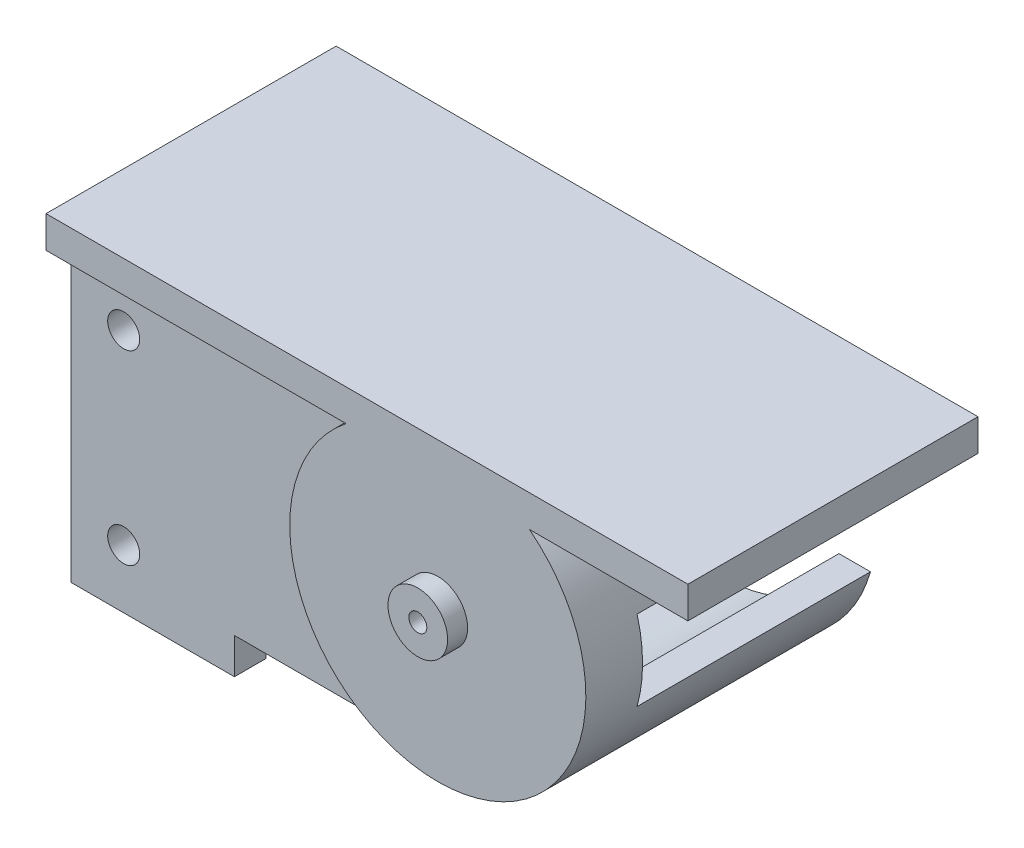
ISO-10303-21;
HEADER;
FILE_DESCRIPTION(('STEP AP214'),'2;1');
FILE_NAME('part.step','',(''),(''),'','','');
FILE_SCHEMA(('AUTOMOTIVE_DESIGN { 1 0 10303 214 1 1 1 1 }'));
ENDSEC;
DATA;
#1=APPLICATION_CONTEXT('core data for automotive mechanical design processes');
#2=APPLICATION_PROTOCOL_DEFINITION('international standard','automotive_design',2000,#1);
#3=PRODUCT_CONTEXT('',#1,'mechanical');
#4=PRODUCT('Part','Part','',(#3));
#5=PRODUCT_RELATED_PRODUCT_CATEGORY('part','',(#4));
#6=PRODUCT_DEFINITION_FORMATION('','',#4);
#7=PRODUCT_DEFINITION_CONTEXT('part definition',#1,'design');
#8=PRODUCT_DEFINITION('design','',#6,#7);
#9=PRODUCT_DEFINITION_SHAPE('','',#8);
#10=(LENGTH_UNIT() NAMED_UNIT(*) SI_UNIT(.MILLI.,.METRE.));
#11=(NAMED_UNIT(*) PLANE_ANGLE_UNIT() SI_UNIT($,.RADIAN.));
#12=(NAMED_UNIT(*) SI_UNIT($,.STERADIAN.) SOLID_ANGLE_UNIT());
#13=UNCERTAINTY_MEASURE_WITH_UNIT(LENGTH_MEASURE(1.E-05),#10,'distance_accuracy_value','');
#14=(GEOMETRIC_REPRESENTATION_CONTEXT(3) GLOBAL_UNCERTAINTY_ASSIGNED_CONTEXT((#13)) GLOBAL_UNIT_ASSIGNED_CONTEXT((#10,
#11,#12)) REPRESENTATION_CONTEXT('',''));
#15=CARTESIAN_POINT('',(0.,0.,0.));
#16=DIRECTION('',(0.,0.,1.));
#17=DIRECTION('',(1.,0.,0.));
#18=AXIS2_PLACEMENT_3D('',#15,#16,#17);
#19=CARTESIAN_POINT('',(0.,0.,31.));
#20=DIRECTION('',(0.,0.,1.));
#21=DIRECTION('',(1.,0.,0.));
#22=AXIS2_PLACEMENT_3D('',#19,#20,#21);
#23=PLANE('',#22);
#24=CARTESIAN_POINT('',(0.,0.,31.));
#25=DIRECTION('',(0.,0.,1.));
#26=DIRECTION('',(1.,0.,0.));
#27=AXIS2_PLACEMENT_3D('',#24,#25,#26);
#28=CIRCLE('',#27,2.98);
#29=CARTESIAN_POINT('',(2.98,0.,31.));
#30=VERTEX_POINT('',#29);
#31=EDGE_CURVE('E12',#30,#30,#28,.T.);
#32=ORIENTED_EDGE('',*,*,#31,.T.);
#33=EDGE_LOOP('',(#32));
#34=FACE_BOUND('',#33,.T.);
#35=CARTESIAN_POINT('',(0.,0.,31.));
#36=DIRECTION('',(0.,0.,1.));
#37=DIRECTION('',(1.,0.,0.));
#38=AXIS2_PLACEMENT_3D('',#35,#36,#37);
#39=CIRCLE('',#38,0.9);
#40=CARTESIAN_POINT('',(0.9,0.,31.));
#41=VERTEX_POINT('',#40);
#42=EDGE_CURVE('E84',#41,#41,#39,.T.);
#43=ORIENTED_EDGE('',*,*,#42,.F.);
#44=EDGE_LOOP('',(#43));
#45=FACE_BOUND('',#44,.T.);
#46=ADVANCED_FACE('F73',(#34,#45),#23,.T.);
#47=CARTESIAN_POINT('',(0.,0.,29.));
#48=DIRECTION('',(0.,0.,1.));
#49=DIRECTION('',(1.,0.,0.));
#50=AXIS2_PLACEMENT_3D('',#47,#48,#49);
#51=PLANE('',#50);
#52=CARTESIAN_POINT('',(0.,0.,29.));
#53=DIRECTION('',(0.,0.,1.));
#54=DIRECTION('',(1.,0.,0.));
#55=AXIS2_PLACEMENT_3D('',#52,#53,#54);
#56=CIRCLE('',#55,2.98);
#57=CARTESIAN_POINT('',(2.98,0.,29.));
#58=VERTEX_POINT('',#57);
#59=EDGE_CURVE('E77',#58,#58,#56,.T.);
#60=ORIENTED_EDGE('',*,*,#59,.F.);
#61=EDGE_LOOP('',(#60));
#62=FACE_BOUND('',#61,.T.);
#63=CARTESIAN_POINT('',(0.,0.,29.));
#64=DIRECTION('',(0.,0.,1.));
#65=DIRECTION('',(1.,0.,0.));
#66=AXIS2_PLACEMENT_3D('',#63,#64,#65);
#67=CIRCLE('',#66,0.9);
#68=CARTESIAN_POINT('',(0.9,0.,29.));
#69=VERTEX_POINT('',#68);
#70=EDGE_CURVE('E86',#69,#69,#67,.T.);
#71=ORIENTED_EDGE('',*,*,#70,.T.);
#72=EDGE_LOOP('',(#71));
#73=FACE_BOUND('',#72,.T.);
#74=ADVANCED_FACE('F96',(#62,#73),#51,.F.);
#75=CARTESIAN_POINT('',(0.,0.,31.));
#76=DIRECTION('',(0.,0.,-1.));
#77=DIRECTION('',(-1.,0.,0.));
#78=AXIS2_PLACEMENT_3D('',#75,#76,#77);
#79=CYLINDRICAL_SURFACE('',#78,2.98);
#80=ORIENTED_EDGE('',*,*,#31,.F.);
#81=EDGE_LOOP('',(#80));
#82=FACE_BOUND('',#81,.T.);
#83=ORIENTED_EDGE('',*,*,#59,.T.);
#84=EDGE_LOOP('',(#83));
#85=FACE_BOUND('',#84,.T.);
#86=ADVANCED_FACE('F75',(#82,#85),#79,.T.);
#87=CARTESIAN_POINT('',(0.,0.,31.));
#88=DIRECTION('',(0.,0.,-1.));
#89=DIRECTION('',(-1.,0.,0.));
#90=AXIS2_PLACEMENT_3D('',#87,#88,#89);
#91=CYLINDRICAL_SURFACE('',#90,0.9);
#92=ORIENTED_EDGE('',*,*,#42,.T.);
#93=EDGE_LOOP('',(#92));
#94=FACE_BOUND('',#93,.T.);
#95=ORIENTED_EDGE('',*,*,#70,.F.);
#96=EDGE_LOOP('',(#95));
#97=FACE_BOUND('',#96,.T.);
#98=ADVANCED_FACE('F92',(#94,#97),#91,.F.);
#99=CLOSED_SHELL('',(#46,#74,#86,#98));
#100=MANIFOLD_SOLID_BREP('B2',#99);
#101=CARTESIAN_POINT('',(0.,0.,23.33));
#102=DIRECTION('',(0.,0.,-1.));
#103=DIRECTION('',(-1.,0.,0.));
#104=AXIS2_PLACEMENT_3D('',#101,#102,#103);
#105=CYLINDRICAL_SURFACE('',#104,14.8);
#106=DIRECTION('',(0.,0.,-1.));
#107=VECTOR('',#106,1.);
#108=CARTESIAN_POINT('',(-14.2492105044455,4.,32.1436259527263));
#109=LINE('',#108,#107);
#110=CARTESIAN_POINT('',(-14.2492105044455,4.,23.32));
#111=VERTEX_POINT('',#110);
#112=CARTESIAN_POINT('',(-14.2492105044455,4.,0.));
#113=VERTEX_POINT('',#112);
#114=EDGE_CURVE('E489',#111,#113,#109,.T.);
#115=ORIENTED_EDGE('',*,*,#114,.F.);
#116=CARTESIAN_POINT('',(0.,0.,23.32));
#117=DIRECTION('',(0.,0.,1.));
#118=DIRECTION('',(1.,0.,0.));
#119=AXIS2_PLACEMENT_3D('',#116,#117,#118);
#120=CIRCLE('',#119,14.8);
#121=CARTESIAN_POINT('',(-9.16600240017425,11.62,23.32));
#122=VERTEX_POINT('',#121);
#123=EDGE_CURVE('E455',#111,#122,#120,.F.);
#124=ORIENTED_EDGE('',*,*,#123,.T.);
#125=DIRECTION('',(0.,0.,-1.));
#126=VECTOR('',#125,1.);
#127=CARTESIAN_POINT('',(-9.16600240017425,11.62,68.2948869957715));
#128=LINE('',#127,#126);
#129=CARTESIAN_POINT('',(-9.16600240017425,11.62,0.));
#130=VERTEX_POINT('',#129);
#131=EDGE_CURVE('E347',#122,#130,#128,.T.);
#132=ORIENTED_EDGE('',*,*,#131,.T.);
#133=CARTESIAN_POINT('',(0.,0.,0.));
#134=DIRECTION('',(0.,0.,1.));
#135=DIRECTION('',(1.,0.,0.));
#136=AXIS2_PLACEMENT_3D('',#133,#134,#135);
#137=CIRCLE('',#136,14.8);
#138=EDGE_CURVE('E71',#130,#113,#137,.T.);
#139=ORIENTED_EDGE('',*,*,#138,.T.);
#140=EDGE_LOOP('',(#115,#124,#132,#139));
#141=FACE_BOUND('',#140,.T.);
#142=ADVANCED_FACE('F135',(#141),#105,.T.);
#143=CARTESIAN_POINT('',(0.,0.,0.));
#144=DIRECTION('',(0.,0.,1.));
#145=DIRECTION('',(1.,0.,0.));
#146=AXIS2_PLACEMENT_3D('',#143,#144,#145);
#147=PLANE('',#146);
#148=DIRECTION('',(-1.,0.,0.));
#149=VECTOR('',#148,1.);
#150=CARTESIAN_POINT('',(0.,4.,0.));
#151=LINE('',#150,#149);
#152=CARTESIAN_POINT('',(14.2492105044455,4.,0.));
#153=VERTEX_POINT('',#152);
#154=CARTESIAN_POINT('',(11.1013512691023,4.,0.));
#155=VERTEX_POINT('',#154);
#156=EDGE_CURVE('E280',#153,#155,#151,.T.);
#157=ORIENTED_EDGE('',*,*,#156,.T.);
#158=CARTESIAN_POINT('',(0.,0.,0.));
#159=DIRECTION('',(0.,0.,1.));
#160=DIRECTION('',(1.,0.,0.));
#161=AXIS2_PLACEMENT_3D('',#158,#159,#160);
#162=CIRCLE('',#161,11.8);
#163=CARTESIAN_POINT('',(-11.1013512691023,4.,0.));
#164=VERTEX_POINT('',#163);
#165=EDGE_CURVE('E308',#155,#164,#162,.T.);
#166=ORIENTED_EDGE('',*,*,#165,.T.);
#167=DIRECTION('',(-1.,0.,0.));
#168=VECTOR('',#167,1.);
#169=CARTESIAN_POINT('',(0.,4.,0.));
#170=LINE('',#169,#168);
#171=EDGE_CURVE('E479',#164,#113,#170,.T.);
#172=ORIENTED_EDGE('',*,*,#171,.T.);
#173=ORIENTED_EDGE('',*,*,#138,.F.);
#174=DIRECTION('',(1.,0.,0.));
#175=VECTOR('',#174,1.);
#176=CARTESIAN_POINT('',(0.,11.62,0.));
#177=LINE('',#176,#175);
#178=CARTESIAN_POINT('',(-39.1660024001742,11.62,0.));
#179=VERTEX_POINT('',#178);
#180=EDGE_CURVE('E351',#179,#130,#177,.T.);
#181=ORIENTED_EDGE('',*,*,#180,.F.);
#182=DIRECTION('',(0.,-1.,0.));
#183=VECTOR('',#182,1.);
#184=CARTESIAN_POINT('',(-39.1660024001742,0.,0.));
#185=LINE('',#184,#183);
#186=CARTESIAN_POINT('',(-39.1660024001742,14.8,0.));
#187=VERTEX_POINT('',#186);
#188=EDGE_CURVE('E356',#187,#179,#185,.T.);
#189=ORIENTED_EDGE('',*,*,#188,.F.);
#190=DIRECTION('',(1.,0.,0.));
#191=VECTOR('',#190,1.);
#192=CARTESIAN_POINT('',(0.,14.8,0.));
#193=LINE('',#192,#191);
#194=CARTESIAN_POINT('',(25.,14.8,0.));
#195=VERTEX_POINT('',#194);
#196=EDGE_CURVE('E365',#187,#195,#193,.T.);
#197=ORIENTED_EDGE('',*,*,#196,.T.);
#198=DIRECTION('',(0.,1.,0.));
#199=VECTOR('',#198,1.);
#200=CARTESIAN_POINT('',(25.,0.,0.));
#201=LINE('',#200,#199);
#202=CARTESIAN_POINT('',(25.,11.62,0.));
#203=VERTEX_POINT('',#202);
#204=EDGE_CURVE('E374',#203,#195,#201,.T.);
#205=ORIENTED_EDGE('',*,*,#204,.F.);
#206=DIRECTION('',(1.,0.,0.));
#207=VECTOR('',#206,1.);
#208=CARTESIAN_POINT('',(0.,11.62,0.));
#209=LINE('',#208,#207);
#210=CARTESIAN_POINT('',(9.16600240017425,11.62,0.));
#211=VERTEX_POINT('',#210);
#212=EDGE_CURVE('E306',#211,#203,#209,.T.);
#213=ORIENTED_EDGE('',*,*,#212,.F.);
#214=EDGE_CURVE('E145',#153,#211,#137,.T.);
#215=ORIENTED_EDGE('',*,*,#214,.F.);
#216=EDGE_LOOP('',(#157,#166,#172,#173,#181,#189,#197,#205,#213,#215));
#217=FACE_BOUND('',#216,.T.);
#218=ADVANCED_FACE('F303',(#217),#147,.F.);
#219=CARTESIAN_POINT('',(0.,0.,23.33));
#220=DIRECTION('',(0.,0.,-1.));
#221=DIRECTION('',(-1.,0.,0.));
#222=AXIS2_PLACEMENT_3D('',#219,#220,#221);
#223=CYLINDRICAL_SURFACE('',#222,11.8);
#224=ORIENTED_EDGE('',*,*,#165,.F.);
#225=DIRECTION('',(0.,0.,-1.));
#226=VECTOR('',#225,1.);
#227=CARTESIAN_POINT('',(11.1013512691023,4.,32.1436259527263));
#228=LINE('',#227,#226);
#229=CARTESIAN_POINT('',(11.1013512691023,4.,23.33));
#230=VERTEX_POINT('',#229);
#231=EDGE_CURVE('E286',#230,#155,#228,.T.);
#232=ORIENTED_EDGE('',*,*,#231,.F.);
#233=CARTESIAN_POINT('',(0.,0.,23.33));
#234=DIRECTION('',(0.,0.,1.));
#235=DIRECTION('',(1.,0.,0.));
#236=AXIS2_PLACEMENT_3D('',#233,#234,#235);
#237=CIRCLE('',#236,11.8);
#238=CARTESIAN_POINT('',(-11.1013512691023,4.,23.33));
#239=VERTEX_POINT('',#238);
#240=EDGE_CURVE('E315',#230,#239,#237,.T.);
#241=ORIENTED_EDGE('',*,*,#240,.T.);
#242=DIRECTION('',(0.,0.,-1.));
#243=VECTOR('',#242,1.);
#244=CARTESIAN_POINT('',(-11.1013512691023,4.,32.1436259527263));
#245=LINE('',#244,#243);
#246=EDGE_CURVE('E488',#239,#164,#245,.T.);
#247=ORIENTED_EDGE('',*,*,#246,.T.);
#248=EDGE_LOOP('',(#224,#232,#241,#247));
#249=FACE_BOUND('',#248,.T.);
#250=ADVANCED_FACE('F603',(#249),#223,.F.);
#251=CARTESIAN_POINT('',(0.,11.62,68.2948869957715));
#252=DIRECTION('',(0.,1.,0.));
#253=DIRECTION('',(-1.,0.,0.));
#254=AXIS2_PLACEMENT_3D('',#251,#252,#253);
#255=PLANE('',#254);
#256=ORIENTED_EDGE('',*,*,#131,.F.);
#257=DIRECTION('',(1.,0.,0.));
#258=VECTOR('',#257,1.);
#259=CARTESIAN_POINT('',(-39.1660024001742,11.62,23.32));
#260=LINE('',#259,#258);
#261=CARTESIAN_POINT('',(-39.1660024001742,11.62,23.32));
#262=VERTEX_POINT('',#261);
#263=EDGE_CURVE('E419',#262,#122,#260,.T.);
#264=ORIENTED_EDGE('',*,*,#263,.F.);
#265=DIRECTION('',(0.,0.,-1.));
#266=VECTOR('',#265,1.);
#267=CARTESIAN_POINT('',(-39.1660024001742,11.62,68.2948869957715));
#268=LINE('',#267,#266);
#269=EDGE_CURVE('E352',#262,#179,#268,.T.);
#270=ORIENTED_EDGE('',*,*,#269,.T.);
#271=ORIENTED_EDGE('',*,*,#180,.T.);
#272=EDGE_LOOP('',(#256,#264,#270,#271));
#273=FACE_BOUND('',#272,.T.);
#274=ADVANCED_FACE('F554',(#273),#255,.F.);
#275=CARTESIAN_POINT('',(-22.8306830953215,-18.38,26.5));
#276=DIRECTION('',(-1.,0.,0.));
#277=DIRECTION('',(0.,0.,1.));
#278=AXIS2_PLACEMENT_3D('',#275,#276,#277);
#279=PLANE('',#278);
#280=DIRECTION('',(0.,0.,1.));
#281=VECTOR('',#280,1.);
#282=CARTESIAN_POINT('',(-22.8306830953215,-14.8,-11.5978534649397));
#283=LINE('',#282,#281);
#284=CARTESIAN_POINT('',(-22.8306830953215,-14.8,23.32));
#285=VERTEX_POINT('',#284);
#286=CARTESIAN_POINT('',(-22.8306830953215,-14.8,26.5));
#287=VERTEX_POINT('',#286);
#288=EDGE_CURVE('E435',#285,#287,#283,.T.);
#289=ORIENTED_EDGE('',*,*,#288,.T.);
#290=DIRECTION('',(0.,1.,0.));
#291=VECTOR('',#290,1.);
#292=CARTESIAN_POINT('',(-22.8306830953215,-18.38,26.5));
#293=LINE('',#292,#291);
#294=CARTESIAN_POINT('',(-22.8306830953215,-18.38,26.5));
#295=VERTEX_POINT('',#294);
#296=EDGE_CURVE('E405',#295,#287,#293,.T.);
#297=ORIENTED_EDGE('',*,*,#296,.F.);
#298=DIRECTION('',(0.,0.,1.));
#299=VECTOR('',#298,1.);
#300=CARTESIAN_POINT('',(-22.8306830953215,-18.38,26.5));
#301=LINE('',#300,#299);
#302=CARTESIAN_POINT('',(-22.8306830953215,-18.38,23.32));
#303=VERTEX_POINT('',#302);
#304=EDGE_CURVE('E426',#303,#295,#301,.T.);
#305=ORIENTED_EDGE('',*,*,#304,.F.);
#306=DIRECTION('',(0.,1.,0.));
#307=VECTOR('',#306,1.);
#308=CARTESIAN_POINT('',(-22.8306830953215,-18.38,23.32));
#309=LINE('',#308,#307);
#310=EDGE_CURVE('E401',#303,#285,#309,.T.);
#311=ORIENTED_EDGE('',*,*,#310,.T.);
#312=EDGE_LOOP('',(#289,#297,#305,#311));
#313=FACE_BOUND('',#312,.T.);
#314=ADVANCED_FACE('F589',(#313),#279,.F.);
#315=DIRECTION('',(-1.,0.,0.));
#316=VECTOR('',#315,1.);
#317=CARTESIAN_POINT('',(-39.1660024001742,11.62,26.5));
#318=LINE('',#317,#316);
#319=CARTESIAN_POINT('',(-9.16600240017425,11.62,26.5));
#320=VERTEX_POINT('',#319);
#321=CARTESIAN_POINT('',(-39.1660024001742,11.62,26.5));
#322=VERTEX_POINT('',#321);
#323=EDGE_CURVE('E414',#320,#322,#318,.T.);
#324=ORIENTED_EDGE('',*,*,#323,.F.);
#325=CARTESIAN_POINT('',(-9.16600240017425,11.62,29.));
#326=VERTEX_POINT('',#325);
#327=EDGE_CURVE('E342',#326,#320,#128,.T.);
#328=ORIENTED_EDGE('',*,*,#327,.F.);
#329=DIRECTION('',(1.,0.,0.));
#330=VECTOR('',#329,1.);
#331=CARTESIAN_POINT('',(0.,11.62,29.));
#332=LINE('',#331,#330);
#333=CARTESIAN_POINT('',(-39.1660024001742,11.62,29.));
#334=VERTEX_POINT('',#333);
#335=EDGE_CURVE('E338',#334,#326,#332,.T.);
#336=ORIENTED_EDGE('',*,*,#335,.F.);
#337=EDGE_CURVE('E348',#334,#322,#268,.T.);
#338=ORIENTED_EDGE('',*,*,#337,.T.);
#339=EDGE_LOOP('',(#324,#328,#336,#338));
#340=FACE_BOUND('',#339,.T.);
#341=ADVANCED_FACE('F577',(#340),#255,.F.);
#342=CARTESIAN_POINT('',(-14.2492105044455,-4.,0.));
#343=VERTEX_POINT('',#342);
#344=CARTESIAN_POINT('',(14.2492105044455,-4.,0.));
#345=VERTEX_POINT('',#344);
#346=EDGE_CURVE('E144',#343,#345,#137,.T.);
#347=ORIENTED_EDGE('',*,*,#346,.T.);
#348=DIRECTION('',(0.,0.,-1.));
#349=VECTOR('',#348,1.);
#350=CARTESIAN_POINT('',(14.2492105044455,-4.,32.1436259527263));
#351=LINE('',#350,#349);
#352=CARTESIAN_POINT('',(14.2492105044455,-4.,23.33));
#353=VERTEX_POINT('',#352);
#354=EDGE_CURVE('E471',#353,#345,#351,.T.);
#355=ORIENTED_EDGE('',*,*,#354,.F.);
#356=CARTESIAN_POINT('',(0.,0.,23.33));
#357=DIRECTION('',(0.,0.,1.));
#358=DIRECTION('',(1.,0.,0.));
#359=AXIS2_PLACEMENT_3D('',#356,#357,#358);
#360=CIRCLE('',#359,14.8);
#361=CARTESIAN_POINT('',(14.2492105044455,4.,23.33));
#362=VERTEX_POINT('',#361);
#363=EDGE_CURVE('E292',#362,#353,#360,.F.);
#364=ORIENTED_EDGE('',*,*,#363,.F.);
#365=DIRECTION('',(0.,0.,-1.));
#366=VECTOR('',#365,1.);
#367=CARTESIAN_POINT('',(14.2492105044455,4.,32.1436259527263));
#368=LINE('',#367,#366);
#369=EDGE_CURVE('E283',#362,#153,#368,.T.);
#370=ORIENTED_EDGE('',*,*,#369,.T.);
#371=ORIENTED_EDGE('',*,*,#214,.T.);
#372=DIRECTION('',(0.,0.,-1.));
#373=VECTOR('',#372,1.);
#374=CARTESIAN_POINT('',(9.16600240017425,11.62,68.2948869957715));
#375=LINE('',#374,#373);
#376=CARTESIAN_POINT('',(9.16600240017425,11.62,29.));
#377=VERTEX_POINT('',#376);
#378=EDGE_CURVE('E378',#377,#211,#375,.T.);
#379=ORIENTED_EDGE('',*,*,#378,.F.);
#380=CARTESIAN_POINT('',(0.,0.,29.));
#381=DIRECTION('',(0.,0.,1.));
#382=DIRECTION('',(1.,0.,0.));
#383=AXIS2_PLACEMENT_3D('',#380,#381,#382);
#384=CIRCLE('',#383,14.8);
#385=EDGE_CURVE('E329',#326,#377,#384,.T.);
#386=ORIENTED_EDGE('',*,*,#385,.F.);
#387=ORIENTED_EDGE('',*,*,#327,.T.);
#388=CARTESIAN_POINT('',(0.,0.,26.5));
#389=DIRECTION('',(0.,0.,1.));
#390=DIRECTION('',(1.,0.,0.));
#391=AXIS2_PLACEMENT_3D('',#388,#389,#390);
#392=CIRCLE('',#391,14.8);
#393=CARTESIAN_POINT('',(0.,-14.8,26.5));
#394=VERTEX_POINT('',#393);
#395=EDGE_CURVE('E446',#320,#394,#392,.T.);
#396=ORIENTED_EDGE('',*,*,#395,.T.);
#397=DIRECTION('',(0.,0.,1.));
#398=VECTOR('',#397,1.);
#399=CARTESIAN_POINT('',(0.,-14.8,-11.5978534649397));
#400=LINE('',#399,#398);
#401=CARTESIAN_POINT('',(0.,-14.8,23.32));
#402=VERTEX_POINT('',#401);
#403=EDGE_CURVE('E439',#402,#394,#400,.T.);
#404=ORIENTED_EDGE('',*,*,#403,.F.);
#405=CARTESIAN_POINT('',(-14.2492105044455,-4.,23.32));
#406=VERTEX_POINT('',#405);
#407=EDGE_CURVE('E423',#402,#406,#120,.F.);
#408=ORIENTED_EDGE('',*,*,#407,.T.);
#409=DIRECTION('',(0.,0.,-1.));
#410=VECTOR('',#409,1.);
#411=CARTESIAN_POINT('',(-14.2492105044455,-4.,32.1436259527263));
#412=LINE('',#411,#410);
#413=EDGE_CURVE('E483',#406,#343,#412,.T.);
#414=ORIENTED_EDGE('',*,*,#413,.T.);
#415=EDGE_LOOP('',(#347,#355,#364,#370,#371,#379,#386,#387,#396,#404,#408,#414));
#416=FACE_BOUND('',#415,.T.);
#417=ADVANCED_FACE('F137',(#416),#105,.T.);
#418=CARTESIAN_POINT('',(-11.1013512691023,-4.,0.));
#419=VERTEX_POINT('',#418);
#420=CARTESIAN_POINT('',(11.1013512691023,-4.,0.));
#421=VERTEX_POINT('',#420);
#422=EDGE_CURVE('E311',#419,#421,#162,.T.);
#423=ORIENTED_EDGE('',*,*,#422,.T.);
#424=DIRECTION('',(-1.,0.,0.));
#425=VECTOR('',#424,1.);
#426=CARTESIAN_POINT('',(0.,-4.,0.));
#427=LINE('',#426,#425);
#428=EDGE_CURVE('E518',#345,#421,#427,.T.);
#429=ORIENTED_EDGE('',*,*,#428,.F.);
#430=ORIENTED_EDGE('',*,*,#346,.F.);
#431=DIRECTION('',(-1.,0.,0.));
#432=VECTOR('',#431,1.);
#433=CARTESIAN_POINT('',(0.,-4.,0.));
#434=LINE('',#433,#432);
#435=EDGE_CURVE('E499',#419,#343,#434,.T.);
#436=ORIENTED_EDGE('',*,*,#435,.F.);
#437=EDGE_LOOP('',(#423,#429,#430,#436));
#438=FACE_BOUND('',#437,.T.);
#439=ADVANCED_FACE('F535',(#438),#147,.F.);
#440=DIRECTION('',(0.,0.,-1.));
#441=VECTOR('',#440,1.);
#442=CARTESIAN_POINT('',(11.1013512691023,-4.,32.1436259527263));
#443=LINE('',#442,#441);
#444=CARTESIAN_POINT('',(11.1013512691023,-4.,23.33));
#445=VERTEX_POINT('',#444);
#446=EDGE_CURVE('E510',#445,#421,#443,.T.);
#447=ORIENTED_EDGE('',*,*,#446,.T.);
#448=ORIENTED_EDGE('',*,*,#422,.F.);
#449=DIRECTION('',(0.,0.,-1.));
#450=VECTOR('',#449,1.);
#451=CARTESIAN_POINT('',(-11.1013512691023,-4.,32.1436259527263));
#452=LINE('',#451,#450);
#453=CARTESIAN_POINT('',(-11.1013512691023,-4.,23.33));
#454=VERTEX_POINT('',#453);
#455=EDGE_CURVE('E475',#454,#419,#452,.T.);
#456=ORIENTED_EDGE('',*,*,#455,.F.);
#457=EDGE_CURVE('E320',#454,#445,#237,.T.);
#458=ORIENTED_EDGE('',*,*,#457,.T.);
#459=EDGE_LOOP('',(#447,#448,#456,#458));
#460=FACE_BOUND('',#459,.T.);
#461=ADVANCED_FACE('F532',(#460),#223,.F.);
#462=CARTESIAN_POINT('',(0.,0.,23.33));
#463=DIRECTION('',(0.,0.,1.));
#464=DIRECTION('',(1.,0.,0.));
#465=AXIS2_PLACEMENT_3D('',#462,#463,#464);
#466=PLANE('',#465);
#467=CARTESIAN_POINT('',(0.,0.,23.33));
#468=DIRECTION('',(0.,0.,1.));
#469=DIRECTION('',(1.,0.,0.));
#470=AXIS2_PLACEMENT_3D('',#467,#468,#469);
#471=CIRCLE('',#470,9.25);
#472=CARTESIAN_POINT('',(9.25,0.,23.33));
#473=VERTEX_POINT('',#472);
#474=EDGE_CURVE('E321',#473,#473,#471,.T.);
#475=ORIENTED_EDGE('',*,*,#474,.T.);
#476=EDGE_LOOP('',(#475));
#477=FACE_BOUND('',#476,.T.);
#478=ORIENTED_EDGE('',*,*,#240,.F.);
#479=DIRECTION('',(-1.,0.,0.));
#480=VECTOR('',#479,1.);
#481=CARTESIAN_POINT('',(0.,4.,23.33));
#482=LINE('',#481,#480);
#483=EDGE_CURVE('E478',#362,#230,#482,.T.);
#484=ORIENTED_EDGE('',*,*,#483,.F.);
#485=ORIENTED_EDGE('',*,*,#363,.T.);
#486=DIRECTION('',(-1.,0.,0.));
#487=VECTOR('',#486,1.);
#488=CARTESIAN_POINT('',(0.,-4.,23.33));
#489=LINE('',#488,#487);
#490=EDGE_CURVE('E152',#353,#445,#489,.T.);
#491=ORIENTED_EDGE('',*,*,#490,.T.);
#492=ORIENTED_EDGE('',*,*,#457,.F.);
#493=DIRECTION('',(-1.,0.,0.));
#494=VECTOR('',#493,1.);
#495=CARTESIAN_POINT('',(0.,-4.,23.33));
#496=LINE('',#495,#494);
#497=CARTESIAN_POINT('',(-14.2492105044455,-4.,23.33));
#498=VERTEX_POINT('',#497);
#499=EDGE_CURVE('E500',#454,#498,#496,.T.);
#500=ORIENTED_EDGE('',*,*,#499,.T.);
#501=CARTESIAN_POINT('',(0.,0.,23.33));
#502=DIRECTION('',(0.,0.,1.));
#503=DIRECTION('',(1.,0.,0.));
#504=AXIS2_PLACEMENT_3D('',#501,#502,#503);
#505=CIRCLE('',#504,14.8);
#506=CARTESIAN_POINT('',(-14.2492105044455,4.,23.33));
#507=VERTEX_POINT('',#506);
#508=EDGE_CURVE('E482',#498,#507,#505,.F.);
#509=ORIENTED_EDGE('',*,*,#508,.T.);
#510=DIRECTION('',(-1.,0.,0.));
#511=VECTOR('',#510,1.);
#512=CARTESIAN_POINT('',(0.,4.,23.33));
#513=LINE('',#512,#511);
#514=EDGE_CURVE('E496',#239,#507,#513,.T.);
#515=ORIENTED_EDGE('',*,*,#514,.F.);
#516=EDGE_LOOP('',(#478,#484,#485,#491,#492,#500,#509,#515));
#517=FACE_BOUND('',#516,.T.);
#518=ADVANCED_FACE('F601',(#477,#517),#466,.F.);
#519=CARTESIAN_POINT('',(0.,0.,26.67));
#520=DIRECTION('',(0.,0.,-1.));
#521=DIRECTION('',(-1.,0.,0.));
#522=AXIS2_PLACEMENT_3D('',#519,#520,#521);
#523=CYLINDRICAL_SURFACE('',#522,9.25);
#524=CARTESIAN_POINT('',(0.,0.,26.67));
#525=DIRECTION('',(0.,0.,1.));
#526=DIRECTION('',(1.,0.,0.));
#527=AXIS2_PLACEMENT_3D('',#524,#525,#526);
#528=CIRCLE('',#527,9.25);
#529=CARTESIAN_POINT('',(9.25,0.,26.67));
#530=VERTEX_POINT('',#529);
#531=EDGE_CURVE('E325',#530,#530,#528,.T.);
#532=ORIENTED_EDGE('',*,*,#531,.T.);
#533=EDGE_LOOP('',(#532));
#534=FACE_BOUND('',#533,.T.);
#535=ORIENTED_EDGE('',*,*,#474,.F.);
#536=EDGE_LOOP('',(#535));
#537=FACE_BOUND('',#536,.T.);
#538=ADVANCED_FACE('F642',(#534,#537),#523,.F.);
#539=CARTESIAN_POINT('',(0.,0.,26.67));
#540=DIRECTION('',(0.,0.,1.));
#541=DIRECTION('',(1.,0.,0.));
#542=AXIS2_PLACEMENT_3D('',#539,#540,#541);
#543=PLANE('',#542);
#544=CARTESIAN_POINT('',(0.,0.,26.67));
#545=DIRECTION('',(0.,0.,1.));
#546=DIRECTION('',(1.,0.,0.));
#547=AXIS2_PLACEMENT_3D('',#544,#545,#546);
#548=CIRCLE('',#547,2.98);
#549=CARTESIAN_POINT('',(2.98,0.,26.67));
#550=VERTEX_POINT('',#549);
#551=EDGE_CURVE('E334',#550,#550,#548,.T.);
#552=ORIENTED_EDGE('',*,*,#551,.T.);
#553=EDGE_LOOP('',(#552));
#554=FACE_BOUND('',#553,.T.);
#555=ORIENTED_EDGE('',*,*,#531,.F.);
#556=EDGE_LOOP('',(#555));
#557=FACE_BOUND('',#556,.T.);
#558=ADVANCED_FACE('F639',(#554,#557),#543,.F.);
#559=CARTESIAN_POINT('',(0.,0.,29.));
#560=DIRECTION('',(0.,0.,1.));
#561=DIRECTION('',(1.,0.,0.));
#562=AXIS2_PLACEMENT_3D('',#559,#560,#561);
#563=PLANE('',#562);
#564=ORIENTED_EDGE('',*,*,#385,.T.);
#565=DIRECTION('',(1.,0.,0.));
#566=VECTOR('',#565,1.);
#567=CARTESIAN_POINT('',(0.,11.62,29.));
#568=LINE('',#567,#566);
#569=CARTESIAN_POINT('',(25.,11.62,29.));
#570=VERTEX_POINT('',#569);
#571=EDGE_CURVE('E382',#377,#570,#568,.T.);
#572=ORIENTED_EDGE('',*,*,#571,.T.);
#573=DIRECTION('',(0.,1.,0.));
#574=VECTOR('',#573,1.);
#575=CARTESIAN_POINT('',(25.,0.,29.));
#576=LINE('',#575,#574);
#577=CARTESIAN_POINT('',(25.,14.8,29.));
#578=VERTEX_POINT('',#577);
#579=EDGE_CURVE('E385',#570,#578,#576,.T.);
#580=ORIENTED_EDGE('',*,*,#579,.T.);
#581=DIRECTION('',(1.,0.,0.));
#582=VECTOR('',#581,1.);
#583=CARTESIAN_POINT('',(0.,14.8,29.));
#584=LINE('',#583,#582);
#585=CARTESIAN_POINT('',(-39.1660024001742,14.8,29.));
#586=VERTEX_POINT('',#585);
#587=EDGE_CURVE('E346',#586,#578,#584,.T.);
#588=ORIENTED_EDGE('',*,*,#587,.F.);
#589=DIRECTION('',(0.,-1.,0.));
#590=VECTOR('',#589,1.);
#591=CARTESIAN_POINT('',(-39.1660024001742,0.,29.));
#592=LINE('',#591,#590);
#593=EDGE_CURVE('E359',#586,#334,#592,.T.);
#594=ORIENTED_EDGE('',*,*,#593,.T.);
#595=ORIENTED_EDGE('',*,*,#335,.T.);
#596=EDGE_LOOP('',(#564,#572,#580,#588,#594,#595));
#597=FACE_BOUND('',#596,.T.);
#598=CARTESIAN_POINT('',(0.,0.,29.));
#599=DIRECTION('',(0.,0.,1.));
#600=DIRECTION('',(1.,0.,0.));
#601=AXIS2_PLACEMENT_3D('',#598,#599,#600);
#602=CIRCLE('',#601,2.98);
#603=CARTESIAN_POINT('',(2.98,0.,29.));
#604=VERTEX_POINT('',#603);
#605=EDGE_CURVE('E333',#604,#604,#602,.T.);
#606=ORIENTED_EDGE('',*,*,#605,.F.);
#607=EDGE_LOOP('',(#606));
#608=FACE_BOUND('',#607,.T.);
#609=ADVANCED_FACE('F572',(#597,#608),#563,.T.);
#610=CARTESIAN_POINT('',(0.,0.,29.));
#611=DIRECTION('',(0.,0.,-1.));
#612=DIRECTION('',(-1.,0.,0.));
#613=AXIS2_PLACEMENT_3D('',#610,#611,#612);
#614=CYLINDRICAL_SURFACE('',#613,2.98);
#615=ORIENTED_EDGE('',*,*,#605,.T.);
#616=EDGE_LOOP('',(#615));
#617=FACE_BOUND('',#616,.T.);
#618=ORIENTED_EDGE('',*,*,#551,.F.);
#619=EDGE_LOOP('',(#618));
#620=FACE_BOUND('',#619,.T.);
#621=ADVANCED_FACE('F633',(#617,#620),#614,.F.);
#622=CARTESIAN_POINT('',(0.,14.8,68.2948869957715));
#623=DIRECTION('',(0.,1.,0.));
#624=DIRECTION('',(-1.,0.,0.));
#625=AXIS2_PLACEMENT_3D('',#622,#623,#624);
#626=PLANE('',#625);
#627=DIRECTION('',(0.,0.,-1.));
#628=VECTOR('',#627,1.);
#629=CARTESIAN_POINT('',(-39.1660024001742,14.8,68.2948869957715));
#630=LINE('',#629,#628);
#631=EDGE_CURVE('E353',#586,#187,#630,.T.);
#632=ORIENTED_EDGE('',*,*,#631,.F.);
#633=ORIENTED_EDGE('',*,*,#587,.T.);
#634=DIRECTION('',(0.,0.,-1.));
#635=VECTOR('',#634,1.);
#636=CARTESIAN_POINT('',(25.,14.8,68.2948869957715));
#637=LINE('',#636,#635);
#638=EDGE_CURVE('E390',#578,#195,#637,.T.);
#639=ORIENTED_EDGE('',*,*,#638,.T.);
#640=ORIENTED_EDGE('',*,*,#196,.F.);
#641=EDGE_LOOP('',(#632,#633,#639,#640));
#642=FACE_BOUND('',#641,.T.);
#643=ADVANCED_FACE('F561',(#642),#626,.T.);
#644=CARTESIAN_POINT('',(-39.1660024001742,0.,68.2948869957715));
#645=DIRECTION('',(1.,0.,0.));
#646=DIRECTION('',(0.,0.,-1.));
#647=AXIS2_PLACEMENT_3D('',#644,#645,#646);
#648=PLANE('',#647);
#649=ORIENTED_EDGE('',*,*,#593,.F.);
#650=ORIENTED_EDGE('',*,*,#631,.T.);
#651=ORIENTED_EDGE('',*,*,#188,.T.);
#652=ORIENTED_EDGE('',*,*,#269,.F.);
#653=DIRECTION('',(0.,1.,0.));
#654=VECTOR('',#653,1.);
#655=CARTESIAN_POINT('',(-39.1660024001742,-18.38,23.32));
#656=LINE('',#655,#654);
#657=CARTESIAN_POINT('',(-39.1660024001742,-18.38,23.32));
#658=VERTEX_POINT('',#657);
#659=EDGE_CURVE('E386',#658,#262,#656,.T.);
#660=ORIENTED_EDGE('',*,*,#659,.F.);
#661=DIRECTION('',(0.,0.,-1.));
#662=VECTOR('',#661,1.);
#663=CARTESIAN_POINT('',(-39.1660024001742,-18.38,26.5));
#664=LINE('',#663,#662);
#665=CARTESIAN_POINT('',(-39.1660024001742,-18.38,26.5));
#666=VERTEX_POINT('',#665);
#667=EDGE_CURVE('E418',#666,#658,#664,.T.);
#668=ORIENTED_EDGE('',*,*,#667,.F.);
#669=DIRECTION('',(0.,1.,0.));
#670=VECTOR('',#669,1.);
#671=CARTESIAN_POINT('',(-39.1660024001742,-18.38,26.5));
#672=LINE('',#671,#670);
#673=EDGE_CURVE('E409',#666,#322,#672,.T.);
#674=ORIENTED_EDGE('',*,*,#673,.T.);
#675=ORIENTED_EDGE('',*,*,#337,.F.);
#676=EDGE_LOOP('',(#649,#650,#651,#652,#660,#668,#674,#675));
#677=FACE_BOUND('',#676,.T.);
#678=ADVANCED_FACE('F628',(#677),#648,.F.);
#679=CARTESIAN_POINT('',(25.,0.,68.2948869957715));
#680=DIRECTION('',(-1.,0.,0.));
#681=DIRECTION('',(0.,0.,1.));
#682=AXIS2_PLACEMENT_3D('',#679,#680,#681);
#683=PLANE('',#682);
#684=ORIENTED_EDGE('',*,*,#579,.F.);
#685=DIRECTION('',(0.,0.,-1.));
#686=VECTOR('',#685,1.);
#687=CARTESIAN_POINT('',(25.,11.62,68.2948869957715));
#688=LINE('',#687,#686);
#689=EDGE_CURVE('E379',#570,#203,#688,.T.);
#690=ORIENTED_EDGE('',*,*,#689,.T.);
#691=ORIENTED_EDGE('',*,*,#204,.T.);
#692=ORIENTED_EDGE('',*,*,#638,.F.);
#693=EDGE_LOOP('',(#684,#690,#691,#692));
#694=FACE_BOUND('',#693,.T.);
#695=ADVANCED_FACE('F566',(#694),#683,.F.);
#696=CARTESIAN_POINT('',(0.,11.62,68.2948869957715));
#697=DIRECTION('',(0.,1.,0.));
#698=DIRECTION('',(-1.,0.,0.));
#699=AXIS2_PLACEMENT_3D('',#696,#697,#698);
#700=PLANE('',#699);
#701=ORIENTED_EDGE('',*,*,#571,.F.);
#702=ORIENTED_EDGE('',*,*,#378,.T.);
#703=ORIENTED_EDGE('',*,*,#212,.T.);
#704=ORIENTED_EDGE('',*,*,#689,.F.);
#705=EDGE_LOOP('',(#701,#702,#703,#704));
#706=FACE_BOUND('',#705,.T.);
#707=ADVANCED_FACE('F569',(#706),#700,.F.);
#708=CARTESIAN_POINT('',(-39.1660024001742,-18.38,23.32));
#709=DIRECTION('',(0.,0.,1.));
#710=DIRECTION('',(1.,0.,0.));
#711=AXIS2_PLACEMENT_3D('',#708,#709,#710);
#712=PLANE('',#711);
#713=CARTESIAN_POINT('',(-33.8999999953216,6.08566633715911,23.32));
#714=DIRECTION('',(0.,0.,1.));
#715=DIRECTION('',(1.,0.,0.));
#716=AXIS2_PLACEMENT_3D('',#713,#714,#715);
#717=CIRCLE('',#716,1.60000000000001);
#718=CARTESIAN_POINT('',(-32.2999999953215,6.08566633715911,23.32));
#719=VERTEX_POINT('',#718);
#720=EDGE_CURVE('E450',#719,#719,#717,.T.);
#721=ORIENTED_EDGE('',*,*,#720,.T.);
#722=EDGE_LOOP('',(#721));
#723=FACE_BOUND('',#722,.T.);
#724=CARTESIAN_POINT('',(-33.8999999953216,-12.5143336628409,23.32));
#725=DIRECTION('',(0.,0.,1.));
#726=DIRECTION('',(1.,0.,0.));
#727=AXIS2_PLACEMENT_3D('',#724,#725,#726);
#728=CIRCLE('',#727,1.6);
#729=CARTESIAN_POINT('',(-32.2999999953215,-12.5143336628409,23.32));
#730=VERTEX_POINT('',#729);
#731=EDGE_CURVE('E462',#730,#730,#728,.T.);
#732=ORIENTED_EDGE('',*,*,#731,.T.);
#733=EDGE_LOOP('',(#732));
#734=FACE_BOUND('',#733,.T.);
#735=ORIENTED_EDGE('',*,*,#263,.T.);
#736=ORIENTED_EDGE('',*,*,#123,.F.);
#737=EDGE_CURVE('E454',#406,#111,#120,.F.);
#738=ORIENTED_EDGE('',*,*,#737,.F.);
#739=ORIENTED_EDGE('',*,*,#407,.F.);
#740=DIRECTION('',(1.,0.,0.));
#741=VECTOR('',#740,1.);
#742=CARTESIAN_POINT('',(0.,-14.8,23.32));
#743=LINE('',#742,#741);
#744=EDGE_CURVE('E443',#285,#402,#743,.T.);
#745=ORIENTED_EDGE('',*,*,#744,.F.);
#746=ORIENTED_EDGE('',*,*,#310,.F.);
#747=DIRECTION('',(1.,0.,0.));
#748=VECTOR('',#747,1.);
#749=CARTESIAN_POINT('',(-39.1660024001742,-18.38,23.32));
#750=LINE('',#749,#748);
#751=EDGE_CURVE('E429',#658,#303,#750,.T.);
#752=ORIENTED_EDGE('',*,*,#751,.F.);
#753=ORIENTED_EDGE('',*,*,#659,.T.);
#754=EDGE_LOOP('',(#735,#736,#738,#739,#745,#746,#752,#753));
#755=FACE_BOUND('',#754,.T.);
#756=ADVANCED_FACE('F593',(#723,#734,#755),#712,.F.);
#757=CARTESIAN_POINT('',(-39.1660024001742,-18.38,26.5));
#758=DIRECTION('',(0.,0.,-1.));
#759=DIRECTION('',(-1.,0.,0.));
#760=AXIS2_PLACEMENT_3D('',#757,#758,#759);
#761=PLANE('',#760);
#762=CARTESIAN_POINT('',(-33.8999999953216,6.08566633715911,26.5));
#763=DIRECTION('',(0.,0.,1.));
#764=DIRECTION('',(1.,0.,0.));
#765=AXIS2_PLACEMENT_3D('',#762,#763,#764);
#766=CIRCLE('',#765,1.60000000000001);
#767=CARTESIAN_POINT('',(-32.2999999953215,6.08566633715911,26.5));
#768=VERTEX_POINT('',#767);
#769=EDGE_CURVE('E466',#768,#768,#766,.T.);
#770=ORIENTED_EDGE('',*,*,#769,.F.);
#771=EDGE_LOOP('',(#770));
#772=FACE_BOUND('',#771,.T.);
#773=CARTESIAN_POINT('',(-33.8999999953216,-12.5143336628409,26.5));
#774=DIRECTION('',(0.,0.,1.));
#775=DIRECTION('',(1.,0.,0.));
#776=AXIS2_PLACEMENT_3D('',#773,#774,#775);
#777=CIRCLE('',#776,1.6);
#778=CARTESIAN_POINT('',(-32.2999999953215,-12.5143336628409,26.5));
#779=VERTEX_POINT('',#778);
#780=EDGE_CURVE('E467',#779,#779,#777,.T.);
#781=ORIENTED_EDGE('',*,*,#780,.F.);
#782=EDGE_LOOP('',(#781));
#783=FACE_BOUND('',#782,.T.);
#784=ORIENTED_EDGE('',*,*,#323,.T.);
#785=ORIENTED_EDGE('',*,*,#673,.F.);
#786=DIRECTION('',(-1.,0.,0.));
#787=VECTOR('',#786,1.);
#788=CARTESIAN_POINT('',(-39.1660024001742,-18.38,26.5));
#789=LINE('',#788,#787);
#790=EDGE_CURVE('E413',#295,#666,#789,.T.);
#791=ORIENTED_EDGE('',*,*,#790,.F.);
#792=ORIENTED_EDGE('',*,*,#296,.T.);
#793=DIRECTION('',(-1.,0.,0.));
#794=VECTOR('',#793,1.);
#795=CARTESIAN_POINT('',(0.,-14.8,26.5));
#796=LINE('',#795,#794);
#797=EDGE_CURVE('E440',#394,#287,#796,.T.);
#798=ORIENTED_EDGE('',*,*,#797,.F.);
#799=ORIENTED_EDGE('',*,*,#395,.F.);
#800=EDGE_LOOP('',(#784,#785,#791,#792,#798,#799));
#801=FACE_BOUND('',#800,.T.);
#802=ADVANCED_FACE('F581',(#772,#783,#801),#761,.F.);
#803=CARTESIAN_POINT('',(0.,-18.38,0.));
#804=DIRECTION('',(0.,-1.,0.));
#805=DIRECTION('',(1.,0.,0.));
#806=AXIS2_PLACEMENT_3D('',#803,#804,#805);
#807=PLANE('',#806);
#808=ORIENTED_EDGE('',*,*,#667,.T.);
#809=ORIENTED_EDGE('',*,*,#751,.T.);
#810=ORIENTED_EDGE('',*,*,#304,.T.);
#811=ORIENTED_EDGE('',*,*,#790,.T.);
#812=EDGE_LOOP('',(#808,#809,#810,#811));
#813=FACE_BOUND('',#812,.T.);
#814=ADVANCED_FACE('F703',(#813),#807,.T.);
#815=CARTESIAN_POINT('',(0.,-14.8,-11.5978534649397));
#816=DIRECTION('',(0.,1.,0.));
#817=DIRECTION('',(0.,0.,1.));
#818=AXIS2_PLACEMENT_3D('',#815,#816,#817);
#819=PLANE('',#818);
#820=ORIENTED_EDGE('',*,*,#288,.F.);
#821=ORIENTED_EDGE('',*,*,#744,.T.);
#822=ORIENTED_EDGE('',*,*,#403,.T.);
#823=ORIENTED_EDGE('',*,*,#797,.T.);
#824=EDGE_LOOP('',(#820,#821,#822,#823));
#825=FACE_BOUND('',#824,.T.);
#826=ADVANCED_FACE('F587',(#825),#819,.F.);
#827=CARTESIAN_POINT('',(-33.8999999953216,-12.5143336628409,0.));
#828=DIRECTION('',(0.,0.,1.));
#829=DIRECTION('',(1.,0.,0.));
#830=AXIS2_PLACEMENT_3D('',#827,#828,#829);
#831=CYLINDRICAL_SURFACE('',#830,1.6);
#832=CARTESIAN_POINT('',(-32.2999999953215,-12.5143336628409,26.5));
#833=CARTESIAN_POINT('',(-32.2999999953215,-12.5143336628409,26.466875));
#834=CARTESIAN_POINT('',(-32.2999999953215,-12.5143336628409,26.43375));
#835=CARTESIAN_POINT('',(-32.2999999953215,-12.5143336628409,26.3675));
#836=CARTESIAN_POINT('',(-32.2999999953215,-12.5143336628409,26.334375));
#837=CARTESIAN_POINT('',(-32.2999999953215,-12.5143336628409,26.268125));
#838=CARTESIAN_POINT('',(-32.2999999953215,-12.5143336628409,26.235));
#839=CARTESIAN_POINT('',(-32.2999999953215,-12.5143336628409,26.16875));
#840=CARTESIAN_POINT('',(-32.2999999953215,-12.5143336628409,26.135625));
#841=CARTESIAN_POINT('',(-32.2999999953215,-12.5143336628409,26.069375));
#842=CARTESIAN_POINT('',(-32.2999999953215,-12.5143336628409,26.03625));
#843=CARTESIAN_POINT('',(-32.2999999953215,-12.5143336628409,25.97));
#844=CARTESIAN_POINT('',(-32.2999999953215,-12.5143336628409,25.936875));
#845=CARTESIAN_POINT('',(-32.2999999953215,-12.5143336628409,25.870625));
#846=CARTESIAN_POINT('',(-32.2999999953215,-12.5143336628409,25.8375));
#847=CARTESIAN_POINT('',(-32.2999999953215,-12.5143336628409,25.77125));
#848=CARTESIAN_POINT('',(-32.2999999953215,-12.5143336628409,25.738125));
#849=CARTESIAN_POINT('',(-32.2999999953215,-12.5143336628409,25.671875));
#850=CARTESIAN_POINT('',(-32.2999999953215,-12.5143336628409,25.63875));
#851=CARTESIAN_POINT('',(-32.2999999953215,-12.5143336628409,25.5725));
#852=CARTESIAN_POINT('',(-32.2999999953215,-12.5143336628409,25.539375));
#853=CARTESIAN_POINT('',(-32.2999999953215,-12.5143336628409,25.473125));
#854=CARTESIAN_POINT('',(-32.2999999953215,-12.5143336628409,25.44));
#855=CARTESIAN_POINT('',(-32.2999999953215,-12.5143336628409,25.37375));
#856=CARTESIAN_POINT('',(-32.2999999953215,-12.5143336628409,25.340625));
#857=CARTESIAN_POINT('',(-32.2999999953215,-12.5143336628409,25.274375));
#858=CARTESIAN_POINT('',(-32.2999999953215,-12.5143336628409,25.24125));
#859=CARTESIAN_POINT('',(-32.2999999953215,-12.5143336628409,25.175));
#860=CARTESIAN_POINT('',(-32.2999999953215,-12.5143336628409,25.141875));
#861=CARTESIAN_POINT('',(-32.2999999953215,-12.5143336628409,25.075625));
#862=CARTESIAN_POINT('',(-32.2999999953215,-12.5143336628409,25.0425));
#863=CARTESIAN_POINT('',(-32.2999999953215,-12.5143336628409,24.97625));
#864=CARTESIAN_POINT('',(-32.2999999953215,-12.5143336628409,24.943125));
#865=CARTESIAN_POINT('',(-32.2999999953215,-12.5143336628409,24.876875));
#866=CARTESIAN_POINT('',(-32.2999999953215,-12.5143336628409,24.84375));
#867=CARTESIAN_POINT('',(-32.2999999953215,-12.5143336628409,24.7775));
#868=CARTESIAN_POINT('',(-32.2999999953215,-12.5143336628409,24.744375));
#869=CARTESIAN_POINT('',(-32.2999999953215,-12.5143336628409,24.678125));
#870=CARTESIAN_POINT('',(-32.2999999953215,-12.5143336628409,24.645));
#871=CARTESIAN_POINT('',(-32.2999999953215,-12.5143336628409,24.57875));
#872=CARTESIAN_POINT('',(-32.2999999953215,-12.5143336628409,24.545625));
#873=CARTESIAN_POINT('',(-32.2999999953215,-12.5143336628409,24.479375));
#874=CARTESIAN_POINT('',(-32.2999999953215,-12.5143336628409,24.44625));
#875=CARTESIAN_POINT('',(-32.2999999953215,-12.5143336628409,24.38));
#876=CARTESIAN_POINT('',(-32.2999999953215,-12.5143336628409,24.346875));
#877=CARTESIAN_POINT('',(-32.2999999953215,-12.5143336628409,24.280625));
#878=CARTESIAN_POINT('',(-32.2999999953215,-12.5143336628409,24.2475));
#879=CARTESIAN_POINT('',(-32.2999999953215,-12.5143336628409,24.18125));
#880=CARTESIAN_POINT('',(-32.2999999953215,-12.5143336628409,24.148125));
#881=CARTESIAN_POINT('',(-32.2999999953215,-12.5143336628409,24.081875));
#882=CARTESIAN_POINT('',(-32.2999999953215,-12.5143336628409,24.04875));
#883=CARTESIAN_POINT('',(-32.2999999953215,-12.5143336628409,23.9825));
#884=CARTESIAN_POINT('',(-32.2999999953215,-12.5143336628409,23.949375));
#885=CARTESIAN_POINT('',(-32.2999999953215,-12.5143336628409,23.883125));
#886=CARTESIAN_POINT('',(-32.2999999953215,-12.5143336628409,23.85));
#887=CARTESIAN_POINT('',(-32.2999999953215,-12.5143336628409,23.78375));
#888=CARTESIAN_POINT('',(-32.2999999953215,-12.5143336628409,23.750625));
#889=CARTESIAN_POINT('',(-32.2999999953215,-12.5143336628409,23.684375));
#890=CARTESIAN_POINT('',(-32.2999999953215,-12.5143336628409,23.65125));
#891=CARTESIAN_POINT('',(-32.2999999953215,-12.5143336628409,23.585));
#892=CARTESIAN_POINT('',(-32.2999999953215,-12.5143336628409,23.551875));
#893=CARTESIAN_POINT('',(-32.2999999953215,-12.5143336628409,23.485625));
#894=CARTESIAN_POINT('',(-32.2999999953215,-12.5143336628409,23.4525));
#895=CARTESIAN_POINT('',(-32.2999999953215,-12.5143336628409,23.38625));
#896=CARTESIAN_POINT('',(-32.2999999953215,-12.5143336628409,23.353125));
#897=CARTESIAN_POINT('',(-32.2999999953215,-12.5143336628409,23.32));
#898=B_SPLINE_CURVE_WITH_KNOTS('',3,(#832,#833,#834,#835,#836,#837,#838,#839,#840,#841,#842,
#843,#844,#845,#846,#847,#848,#849,#850,#851,#852,#853,#854,#855,#856,#857,#858,#859,#860,#861,
#862,#863,#864,#865,#866,#867,#868,#869,#870,#871,#872,#873,#874,#875,#876,#877,#878,#879,#880,
#881,#882,#883,#884,#885,#886,#887,#888,#889,#890,#891,#892,#893,#894,#895,#896,#897),
.UNSPECIFIED.,.F.,.F.,(4,2,2,2,2,2,2,2,2,2,2,2,2,2,2,2,2,2,2,2,2,2,2,2,2,2,2,2,2,2,2,2,4),(0.,
0.0993749999999988,0.198750000000001,0.298125,0.397500000000002,0.496875000000001,
0.596250000000003,0.695625000000002,0.795000000000004,0.894375000000003,0.993750000000002,
1.093125,1.1925,1.291875,1.39125,1.49062500000001,1.59,1.689375,1.78875000000001,1.888125,
1.98750000000001,2.08687500000001,2.18625000000001,2.28562500000001,2.38500000000001,
2.48437500000001,2.58375000000001,2.68312500000001,2.78250000000001,2.88187500000001,
2.98125000000001,3.08062500000001,3.18000000000001),.UNSPECIFIED.);
#899=EDGE_CURVE('BSEAM719',#779,#730,#898,.T.);
#900=ORIENTED_EDGE('',*,*,#780,.T.);
#901=ORIENTED_EDGE('',*,*,#731,.F.);
#902=ORIENTED_EDGE('',*,*,#899,.T.);
#903=ORIENTED_EDGE('',*,*,#899,.F.);
#904=EDGE_LOOP('',(#900,#902,#901,#903));
#905=FACE_BOUND('',#904,.T.);
#906=ADVANCED_FACE('F719',(#905),#831,.F.);
#907=CARTESIAN_POINT('',(-33.8999999953216,6.08566633715911,0.));
#908=DIRECTION('',(0.,0.,1.));
#909=DIRECTION('',(1.,0.,0.));
#910=AXIS2_PLACEMENT_3D('',#907,#908,#909);
#911=CYLINDRICAL_SURFACE('',#910,1.60000000000001);
#912=CARTESIAN_POINT('',(-32.2999999953215,6.08566633715911,26.5));
#913=CARTESIAN_POINT('',(-32.2999999953215,6.08566633715911,26.466875));
#914=CARTESIAN_POINT('',(-32.2999999953215,6.08566633715911,26.43375));
#915=CARTESIAN_POINT('',(-32.2999999953215,6.08566633715911,26.3675));
#916=CARTESIAN_POINT('',(-32.2999999953215,6.08566633715911,26.334375));
#917=CARTESIAN_POINT('',(-32.2999999953215,6.08566633715911,26.268125));
#918=CARTESIAN_POINT('',(-32.2999999953215,6.08566633715911,26.235));
#919=CARTESIAN_POINT('',(-32.2999999953215,6.08566633715911,26.16875));
#920=CARTESIAN_POINT('',(-32.2999999953215,6.08566633715911,26.135625));
#921=CARTESIAN_POINT('',(-32.2999999953215,6.08566633715911,26.069375));
#922=CARTESIAN_POINT('',(-32.2999999953215,6.08566633715911,26.03625));
#923=CARTESIAN_POINT('',(-32.2999999953215,6.08566633715911,25.97));
#924=CARTESIAN_POINT('',(-32.2999999953215,6.08566633715911,25.936875));
#925=CARTESIAN_POINT('',(-32.2999999953215,6.08566633715911,25.870625));
#926=CARTESIAN_POINT('',(-32.2999999953215,6.08566633715911,25.8375));
#927=CARTESIAN_POINT('',(-32.2999999953215,6.08566633715911,25.77125));
#928=CARTESIAN_POINT('',(-32.2999999953215,6.08566633715911,25.738125));
#929=CARTESIAN_POINT('',(-32.2999999953215,6.08566633715911,25.671875));
#930=CARTESIAN_POINT('',(-32.2999999953215,6.08566633715911,25.63875));
#931=CARTESIAN_POINT('',(-32.2999999953215,6.08566633715911,25.5725));
#932=CARTESIAN_POINT('',(-32.2999999953215,6.08566633715911,25.539375));
#933=CARTESIAN_POINT('',(-32.2999999953215,6.08566633715911,25.473125));
#934=CARTESIAN_POINT('',(-32.2999999953215,6.08566633715911,25.44));
#935=CARTESIAN_POINT('',(-32.2999999953215,6.08566633715911,25.37375));
#936=CARTESIAN_POINT('',(-32.2999999953215,6.08566633715911,25.340625));
#937=CARTESIAN_POINT('',(-32.2999999953215,6.08566633715911,25.274375));
#938=CARTESIAN_POINT('',(-32.2999999953215,6.08566633715911,25.24125));
#939=CARTESIAN_POINT('',(-32.2999999953215,6.08566633715911,25.175));
#940=CARTESIAN_POINT('',(-32.2999999953215,6.08566633715911,25.141875));
#941=CARTESIAN_POINT('',(-32.2999999953215,6.08566633715911,25.075625));
#942=CARTESIAN_POINT('',(-32.2999999953215,6.08566633715911,25.0425));
#943=CARTESIAN_POINT('',(-32.2999999953215,6.08566633715911,24.97625));
#944=CARTESIAN_POINT('',(-32.2999999953215,6.08566633715911,24.943125));
#945=CARTESIAN_POINT('',(-32.2999999953215,6.08566633715911,24.876875));
#946=CARTESIAN_POINT('',(-32.2999999953215,6.08566633715911,24.84375));
#947=CARTESIAN_POINT('',(-32.2999999953215,6.08566633715911,24.7775));
#948=CARTESIAN_POINT('',(-32.2999999953215,6.08566633715911,24.744375));
#949=CARTESIAN_POINT('',(-32.2999999953215,6.08566633715911,24.678125));
#950=CARTESIAN_POINT('',(-32.2999999953215,6.08566633715911,24.645));
#951=CARTESIAN_POINT('',(-32.2999999953215,6.08566633715911,24.57875));
#952=CARTESIAN_POINT('',(-32.2999999953215,6.08566633715911,24.545625));
#953=CARTESIAN_POINT('',(-32.2999999953215,6.08566633715911,24.479375));
#954=CARTESIAN_POINT('',(-32.2999999953215,6.08566633715911,24.44625));
#955=CARTESIAN_POINT('',(-32.2999999953215,6.08566633715911,24.38));
#956=CARTESIAN_POINT('',(-32.2999999953215,6.08566633715911,24.346875));
#957=CARTESIAN_POINT('',(-32.2999999953215,6.08566633715911,24.280625));
#958=CARTESIAN_POINT('',(-32.2999999953215,6.08566633715911,24.2475));
#959=CARTESIAN_POINT('',(-32.2999999953215,6.08566633715911,24.18125));
#960=CARTESIAN_POINT('',(-32.2999999953215,6.08566633715911,24.148125));
#961=CARTESIAN_POINT('',(-32.2999999953215,6.08566633715911,24.081875));
#962=CARTESIAN_POINT('',(-32.2999999953215,6.08566633715911,24.04875));
#963=CARTESIAN_POINT('',(-32.2999999953215,6.08566633715911,23.9825));
#964=CARTESIAN_POINT('',(-32.2999999953215,6.08566633715911,23.949375));
#965=CARTESIAN_POINT('',(-32.2999999953215,6.08566633715911,23.883125));
#966=CARTESIAN_POINT('',(-32.2999999953215,6.08566633715911,23.85));
#967=CARTESIAN_POINT('',(-32.2999999953215,6.08566633715911,23.78375));
#968=CARTESIAN_POINT('',(-32.2999999953215,6.08566633715911,23.750625));
#969=CARTESIAN_POINT('',(-32.2999999953215,6.08566633715911,23.684375));
#970=CARTESIAN_POINT('',(-32.2999999953215,6.08566633715911,23.65125));
#971=CARTESIAN_POINT('',(-32.2999999953215,6.08566633715911,23.585));
#972=CARTESIAN_POINT('',(-32.2999999953215,6.08566633715911,23.551875));
#973=CARTESIAN_POINT('',(-32.2999999953215,6.08566633715911,23.485625));
#974=CARTESIAN_POINT('',(-32.2999999953215,6.08566633715911,23.4525));
#975=CARTESIAN_POINT('',(-32.2999999953215,6.08566633715911,23.38625));
#976=CARTESIAN_POINT('',(-32.2999999953215,6.08566633715911,23.353125));
#977=CARTESIAN_POINT('',(-32.2999999953215,6.08566633715911,23.32));
#978=B_SPLINE_CURVE_WITH_KNOTS('',3,(#912,#913,#914,#915,#916,#917,#918,#919,#920,#921,#922,
#923,#924,#925,#926,#927,#928,#929,#930,#931,#932,#933,#934,#935,#936,#937,#938,#939,#940,#941,
#942,#943,#944,#945,#946,#947,#948,#949,#950,#951,#952,#953,#954,#955,#956,#957,#958,#959,#960,
#961,#962,#963,#964,#965,#966,#967,#968,#969,#970,#971,#972,#973,#974,#975,#976,#977),
.UNSPECIFIED.,.F.,.F.,(4,2,2,2,2,2,2,2,2,2,2,2,2,2,2,2,2,2,2,2,2,2,2,2,2,2,2,2,2,2,2,2,4),(0.,
0.0993749999999988,0.198750000000001,0.298125,0.397500000000002,0.496875000000001,
0.596250000000003,0.695625000000002,0.795000000000004,0.894375000000003,0.993750000000002,
1.093125,1.1925,1.291875,1.39125,1.49062500000001,1.59,1.689375,1.78875000000001,1.888125,
1.98750000000001,2.08687500000001,2.18625000000001,2.28562500000001,2.38500000000001,
2.48437500000001,2.58375000000001,2.68312500000001,2.78250000000001,2.88187500000001,
2.98125000000001,3.08062500000001,3.18000000000001),.UNSPECIFIED.);
#979=EDGE_CURVE('BSEAM725',#768,#719,#978,.T.);
#980=ORIENTED_EDGE('',*,*,#769,.T.);
#981=ORIENTED_EDGE('',*,*,#720,.F.);
#982=ORIENTED_EDGE('',*,*,#979,.T.);
#983=ORIENTED_EDGE('',*,*,#979,.F.);
#984=EDGE_LOOP('',(#980,#982,#981,#983));
#985=FACE_BOUND('',#984,.T.);
#986=ADVANCED_FACE('F725',(#985),#911,.F.);
#987=CARTESIAN_POINT('',(0.,0.,32.1436259527263));
#988=DIRECTION('',(0.,0.,-1.));
#989=DIRECTION('',(-1.,0.,0.));
#990=AXIS2_PLACEMENT_3D('',#987,#988,#989);
#991=CYLINDRICAL_SURFACE('',#990,14.8);
#992=EDGE_CURVE('E484',#507,#111,#109,.T.);
#993=ORIENTED_EDGE('',*,*,#992,.F.);
#994=ORIENTED_EDGE('',*,*,#508,.F.);
#995=EDGE_CURVE('E160',#498,#406,#412,.T.);
#996=ORIENTED_EDGE('',*,*,#995,.T.);
#997=ORIENTED_EDGE('',*,*,#737,.T.);
#998=EDGE_LOOP('',(#993,#994,#996,#997));
#999=FACE_BOUND('',#998,.T.);
#1000=ADVANCED_FACE('F598',(#999),#991,.F.);
#1001=CARTESIAN_POINT('',(0.,-4.,32.1436259527263));
#1002=DIRECTION('',(0.,-1.,0.));
#1003=DIRECTION('',(0.,0.,-1.));
#1004=AXIS2_PLACEMENT_3D('',#1001,#1002,#1003);
#1005=PLANE('',#1004);
#1006=ORIENTED_EDGE('',*,*,#455,.T.);
#1007=ORIENTED_EDGE('',*,*,#435,.T.);
#1008=ORIENTED_EDGE('',*,*,#413,.F.);
#1009=ORIENTED_EDGE('',*,*,#995,.F.);
#1010=ORIENTED_EDGE('',*,*,#499,.F.);
#1011=EDGE_LOOP('',(#1006,#1007,#1008,#1009,#1010));
#1012=FACE_BOUND('',#1011,.T.);
#1013=ADVANCED_FACE('F538',(#1012),#1005,.F.);
#1014=CARTESIAN_POINT('',(0.,4.,32.1436259527263));
#1015=DIRECTION('',(0.,-1.,0.));
#1016=DIRECTION('',(0.,0.,-1.));
#1017=AXIS2_PLACEMENT_3D('',#1014,#1015,#1016);
#1018=PLANE('',#1017);
#1019=ORIENTED_EDGE('',*,*,#514,.T.);
#1020=ORIENTED_EDGE('',*,*,#992,.T.);
#1021=ORIENTED_EDGE('',*,*,#114,.T.);
#1022=ORIENTED_EDGE('',*,*,#171,.F.);
#1023=ORIENTED_EDGE('',*,*,#246,.F.);
#1024=EDGE_LOOP('',(#1019,#1020,#1021,#1022,#1023));
#1025=FACE_BOUND('',#1024,.T.);
#1026=ADVANCED_FACE('F545',(#1025),#1018,.T.);
#1027=CARTESIAN_POINT('',(0.,-4.,32.1436259527263));
#1028=DIRECTION('',(0.,-1.,0.));
#1029=DIRECTION('',(0.,0.,-1.));
#1030=AXIS2_PLACEMENT_3D('',#1027,#1028,#1029);
#1031=PLANE('',#1030);
#1032=ORIENTED_EDGE('',*,*,#354,.T.);
#1033=ORIENTED_EDGE('',*,*,#428,.T.);
#1034=ORIENTED_EDGE('',*,*,#446,.F.);
#1035=ORIENTED_EDGE('',*,*,#490,.F.);
#1036=EDGE_LOOP('',(#1032,#1033,#1034,#1035));
#1037=FACE_BOUND('',#1036,.T.);
#1038=ADVANCED_FACE('F526',(#1037),#1031,.F.);
#1039=CARTESIAN_POINT('',(0.,4.,32.1436259527263));
#1040=DIRECTION('',(0.,-1.,0.));
#1041=DIRECTION('',(0.,0.,-1.));
#1042=AXIS2_PLACEMENT_3D('',#1039,#1040,#1041);
#1043=PLANE('',#1042);
#1044=ORIENTED_EDGE('',*,*,#483,.T.);
#1045=ORIENTED_EDGE('',*,*,#231,.T.);
#1046=ORIENTED_EDGE('',*,*,#156,.F.);
#1047=ORIENTED_EDGE('',*,*,#369,.F.);
#1048=EDGE_LOOP('',(#1044,#1045,#1046,#1047));
#1049=FACE_BOUND('',#1048,.T.);
#1050=ADVANCED_FACE('F282',(#1049),#1043,.T.);
#1051=CLOSED_SHELL('',(#142,#218,#250,#274,#314,#341,#417,#439,#461,#518,#538,#558,#609,#621,
#643,#678,#695,#707,#756,#802,#814,#826,#906,#986,#1000,#1013,#1026,#1038,#1050));
#1052=MANIFOLD_SOLID_BREP('B7',#1051);
#1053=ADVANCED_BREP_SHAPE_REPRESENTATION('',(#18,#100,#1052),#14);
#1054=SHAPE_DEFINITION_REPRESENTATION(#9,#1053);
ENDSEC;
END-ISO-10303-21;
